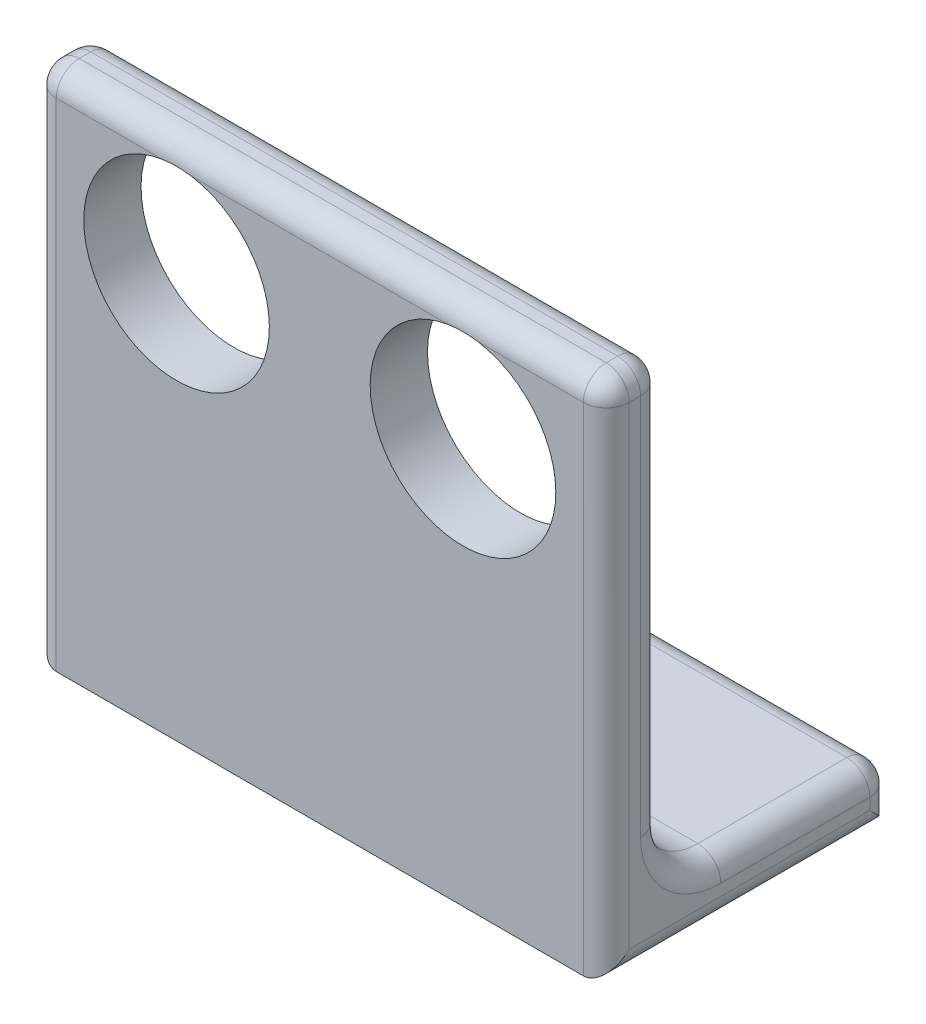
ISO-10303-21;
HEADER;
FILE_DESCRIPTION(('STEP AP214'),'2;1');
FILE_NAME('part.step','',(''),(''),'','','');
FILE_SCHEMA(('AUTOMOTIVE_DESIGN { 1 0 10303 214 1 1 1 1 }'));
ENDSEC;
DATA;
#1=APPLICATION_CONTEXT('core data for automotive mechanical design processes');
#2=APPLICATION_PROTOCOL_DEFINITION('international standard','automotive_design',2000,#1);
#3=PRODUCT_CONTEXT('',#1,'mechanical');
#4=PRODUCT('Part','Part','',(#3));
#5=PRODUCT_RELATED_PRODUCT_CATEGORY('part','',(#4));
#6=PRODUCT_DEFINITION_FORMATION('','',#4);
#7=PRODUCT_DEFINITION_CONTEXT('part definition',#1,'design');
#8=PRODUCT_DEFINITION('design','',#6,#7);
#9=PRODUCT_DEFINITION_SHAPE('','',#8);
#10=(LENGTH_UNIT() NAMED_UNIT(*) SI_UNIT(.MILLI.,.METRE.));
#11=(NAMED_UNIT(*) PLANE_ANGLE_UNIT() SI_UNIT($,.RADIAN.));
#12=(NAMED_UNIT(*) SI_UNIT($,.STERADIAN.) SOLID_ANGLE_UNIT());
#13=UNCERTAINTY_MEASURE_WITH_UNIT(LENGTH_MEASURE(1.E-05),#10,'distance_accuracy_value','');
#14=(GEOMETRIC_REPRESENTATION_CONTEXT(3) GLOBAL_UNCERTAINTY_ASSIGNED_CONTEXT((#13)) GLOBAL_UNIT_ASSIGNED_CONTEXT((#10,
#11,#12)) REPRESENTATION_CONTEXT('',''));
#15=CARTESIAN_POINT('',(0.,0.,0.));
#16=DIRECTION('',(0.,0.,1.));
#17=DIRECTION('',(1.,0.,0.));
#18=AXIS2_PLACEMENT_3D('',#15,#16,#17);
#19=CARTESIAN_POINT('',(0.,4.99999999999998,0.));
#20=DIRECTION('',(0.,0.,-1.));
#21=DIRECTION('',(-1.,0.,0.));
#22=AXIS2_PLACEMENT_3D('',#19,#20,#21);
#23=PLANE('',#22);
#24=DIRECTION('',(1.,0.,0.));
#25=VECTOR('',#24,1.);
#26=CARTESIAN_POINT('',(0.,43.3395060623667,0.));
#27=LINE('',#26,#25);
#28=CARTESIAN_POINT('',(48.,43.3395060623667,0.));
#29=VERTEX_POINT('',#28);
#30=CARTESIAN_POINT('',(38.768857754045,43.3395060623667,0.));
#31=VERTEX_POINT('',#30);
#32=EDGE_CURVE('E468',#29,#31,#27,.F.);
#33=ORIENTED_EDGE('',*,*,#32,.T.);
#34=CARTESIAN_POINT('',(37.5,35.3395060623667,0.));
#35=DIRECTION('',(0.,0.,-1.));
#36=DIRECTION('',(-1.,0.,0.));
#37=AXIS2_PLACEMENT_3D('',#34,#35,#36);
#38=CIRCLE('',#37,8.1);
#39=CARTESIAN_POINT('',(36.2311422459551,43.3395060623667,0.));
#40=VERTEX_POINT('',#39);
#41=EDGE_CURVE('E71',#31,#40,#38,.T.);
#42=ORIENTED_EDGE('',*,*,#41,.T.);
#43=CARTESIAN_POINT('',(13.768857754045,43.3395060623667,0.));
#44=VERTEX_POINT('',#43);
#45=EDGE_CURVE('E470',#40,#44,#27,.F.);
#46=ORIENTED_EDGE('',*,*,#45,.T.);
#47=CARTESIAN_POINT('',(12.5,35.3395060623667,0.));
#48=DIRECTION('',(0.,0.,-1.));
#49=DIRECTION('',(-1.,0.,0.));
#50=AXIS2_PLACEMENT_3D('',#47,#48,#49);
#51=CIRCLE('',#50,8.1);
#52=CARTESIAN_POINT('',(11.231142245955,43.3395060623667,0.));
#53=VERTEX_POINT('',#52);
#54=EDGE_CURVE('E64',#53,#44,#51,.F.);
#55=ORIENTED_EDGE('',*,*,#54,.F.);
#56=CARTESIAN_POINT('',(2.,43.3395060623667,0.));
#57=VERTEX_POINT('',#56);
#58=EDGE_CURVE('E450',#53,#57,#27,.F.);
#59=ORIENTED_EDGE('',*,*,#58,.T.);
#60=DIRECTION('',(0.,-1.,0.));
#61=VECTOR('',#60,1.);
#62=CARTESIAN_POINT('',(2.,4.99999999999998,0.));
#63=LINE('',#62,#61);
#64=CARTESIAN_POINT('',(2.,0.,0.));
#65=VERTEX_POINT('',#64);
#66=EDGE_CURVE('E384',#57,#65,#63,.T.);
#67=ORIENTED_EDGE('',*,*,#66,.T.);
#68=DIRECTION('',(1.,0.,0.));
#69=VECTOR('',#68,1.);
#70=CARTESIAN_POINT('',(0.,0.,0.));
#71=LINE('',#70,#69);
#72=CARTESIAN_POINT('',(48.,0.,0.));
#73=VERTEX_POINT('',#72);
#74=EDGE_CURVE('E328',#65,#73,#71,.T.);
#75=ORIENTED_EDGE('',*,*,#74,.T.);
#76=DIRECTION('',(0.,-1.,0.));
#77=VECTOR('',#76,1.);
#78=CARTESIAN_POINT('',(48.,4.99999999999998,0.));
#79=LINE('',#78,#77);
#80=EDGE_CURVE('E279',#73,#29,#79,.F.);
#81=ORIENTED_EDGE('',*,*,#80,.T.);
#82=EDGE_LOOP('',(#33,#42,#46,#55,#59,#67,#75,#81));
#83=FACE_BOUND('',#82,.T.);
#84=ADVANCED_FACE('F47',(#83),#23,.F.);
#85=CARTESIAN_POINT('',(0.,45.3395060623667,-5.));
#86=DIRECTION('',(0.,0.,1.));
#87=DIRECTION('',(1.,0.,0.));
#88=AXIS2_PLACEMENT_3D('',#85,#86,#87);
#89=PLANE('',#88);
#90=DIRECTION('',(-1.,0.,0.));
#91=VECTOR('',#90,1.);
#92=CARTESIAN_POINT('',(0.,43.3395060623667,-5.));
#93=LINE('',#92,#91);
#94=CARTESIAN_POINT('',(13.768857754045,43.3395060623667,-5.));
#95=VERTEX_POINT('',#94);
#96=CARTESIAN_POINT('',(36.2311422459551,43.3395060623667,-5.));
#97=VERTEX_POINT('',#96);
#98=EDGE_CURVE('E208',#95,#97,#93,.F.);
#99=ORIENTED_EDGE('',*,*,#98,.T.);
#100=CARTESIAN_POINT('',(37.5,35.3395060623667,-5.));
#101=DIRECTION('',(0.,0.,-1.));
#102=DIRECTION('',(-1.,0.,0.));
#103=AXIS2_PLACEMENT_3D('',#100,#101,#102);
#104=CIRCLE('',#103,8.1);
#105=CARTESIAN_POINT('',(38.768857754045,43.3395060623667,-5.));
#106=VERTEX_POINT('',#105);
#107=EDGE_CURVE('E211',#106,#97,#104,.T.);
#108=ORIENTED_EDGE('',*,*,#107,.F.);
#109=CARTESIAN_POINT('',(48.,43.3395060623667,-5.));
#110=VERTEX_POINT('',#109);
#111=EDGE_CURVE('E51',#106,#110,#93,.F.);
#112=ORIENTED_EDGE('',*,*,#111,.T.);
#113=DIRECTION('',(0.,-1.,0.));
#114=VECTOR('',#113,1.);
#115=CARTESIAN_POINT('',(48.,45.3395060623667,-5.));
#116=LINE('',#115,#114);
#117=CARTESIAN_POINT('',(48.,9.99999999999997,-5.));
#118=VERTEX_POINT('',#117);
#119=EDGE_CURVE('E293',#110,#118,#116,.T.);
#120=ORIENTED_EDGE('',*,*,#119,.T.);
#121=DIRECTION('',(-1.,0.,0.));
#122=VECTOR('',#121,1.);
#123=CARTESIAN_POINT('',(0.,9.99999999999997,-5.));
#124=LINE('',#123,#122);
#125=CARTESIAN_POINT('',(2.,9.99999999999997,-5.));
#126=VERTEX_POINT('',#125);
#127=EDGE_CURVE('E221',#118,#126,#124,.T.);
#128=ORIENTED_EDGE('',*,*,#127,.T.);
#129=DIRECTION('',(0.,-1.,0.));
#130=VECTOR('',#129,1.);
#131=CARTESIAN_POINT('',(2.,45.3395060623667,-5.));
#132=LINE('',#131,#130);
#133=CARTESIAN_POINT('',(2.,43.3395060623667,-5.));
#134=VERTEX_POINT('',#133);
#135=EDGE_CURVE('E371',#126,#134,#132,.F.);
#136=ORIENTED_EDGE('',*,*,#135,.T.);
#137=CARTESIAN_POINT('',(11.231142245955,43.3395060623667,-5.));
#138=VERTEX_POINT('',#137);
#139=EDGE_CURVE('E209',#134,#138,#93,.F.);
#140=ORIENTED_EDGE('',*,*,#139,.T.);
#141=CARTESIAN_POINT('',(12.5,35.3395060623667,-5.));
#142=DIRECTION('',(0.,0.,1.));
#143=DIRECTION('',(1.,0.,0.));
#144=AXIS2_PLACEMENT_3D('',#141,#142,#143);
#145=CIRCLE('',#144,8.1);
#146=EDGE_CURVE('E194',#138,#95,#145,.T.);
#147=ORIENTED_EDGE('',*,*,#146,.T.);
#148=EDGE_LOOP('',(#99,#108,#112,#120,#128,#136,#140,#147));
#149=FACE_BOUND('',#148,.T.);
#150=ADVANCED_FACE('F206',(#149),#89,.F.);
#151=CARTESIAN_POINT('',(0.,43.3395060623667,-2.));
#152=DIRECTION('',(1.,0.,0.));
#153=DIRECTION('',(0.,0.,-1.));
#154=AXIS2_PLACEMENT_3D('',#151,#152,#153);
#155=CYLINDRICAL_SURFACE('',#154,2.);
#156=CARTESIAN_POINT('',(38.768857754045,43.3395060623667,0.));
#157=CARTESIAN_POINT('',(38.6636691925274,43.356190905106,-1.37779770013299E-05));
#158=CARTESIAN_POINT('',(38.5581516499131,43.3707988000134,-0.000209294897362309));
#159=CARTESIAN_POINT('',(38.3466231250194,43.3958431394812,-0.000750693316836424));
#160=CARTESIAN_POINT('',(38.2406121433183,43.4062795889296,-0.00109657463975416));
#161=CARTESIAN_POINT('',(38.0289139331765,43.4229122237599,-0.00172365555034055));
#162=CARTESIAN_POINT('',(37.9232287226811,43.4291340896309,-0.00200523981328003));
#163=CARTESIAN_POINT('',(37.7116956743523,43.4374310005774,-0.00239419391511557));
#164=CARTESIAN_POINT('',(37.6058478371762,43.4395060623667,-0.00250156445618202));
#165=CARTESIAN_POINT('',(37.3941521628238,43.4395060623667,-0.00250156445618193));
#166=CARTESIAN_POINT('',(37.2883043256477,43.4374310005774,-0.00239419391511539));
#167=CARTESIAN_POINT('',(37.0767712773189,43.4291340896309,-0.00200523981327971));
#168=CARTESIAN_POINT('',(36.9710860668235,43.4229122237599,-0.00172365555034018));
#169=CARTESIAN_POINT('',(36.7593878566817,43.4062795889296,-0.00109657463975375));
#170=CARTESIAN_POINT('',(36.6533768749806,43.3958431394812,-0.000750693316836028));
#171=CARTESIAN_POINT('',(36.4418483500869,43.3707988000134,-0.000209294897362058));
#172=CARTESIAN_POINT('',(36.3363308074726,43.356190905106,-1.37779770012064E-05));
#173=CARTESIAN_POINT('',(36.2311422459551,43.3395060623667,0.));
#174=B_SPLINE_CURVE_WITH_KNOTS('',3,(#156,#157,#158,#159,#160,#161,#162,#163,#164,#165,#166,
#167,#168,#169,#170,#171,#172,#173),.UNSPECIFIED.,.F.,.F.,(4,2,2,2,2,2,2,2,4),(0.,
0.31948945098359,0.638978527593862,0.95650293304343,1.2740260587041,1.59154918436477,
1.90907358981434,2.22856266642461,2.5480521174082),.UNSPECIFIED.);
#175=EDGE_CURVE('E613',#31,#40,#174,.T.);
#176=ORIENTED_EDGE('',*,*,#175,.F.);
#177=ORIENTED_EDGE('',*,*,#32,.F.);
#178=CARTESIAN_POINT('',(48.,43.3395060623667,-2.));
#179=DIRECTION('',(1.,0.,0.));
#180=DIRECTION('',(0.,0.,-1.));
#181=AXIS2_PLACEMENT_3D('',#178,#179,#180);
#182=CIRCLE('',#181,2.);
#183=CARTESIAN_POINT('',(48.,45.3395060623667,-2.));
#184=VERTEX_POINT('',#183);
#185=EDGE_CURVE('E282',#29,#184,#182,.F.);
#186=ORIENTED_EDGE('',*,*,#185,.T.);
#187=DIRECTION('',(1.,0.,0.));
#188=VECTOR('',#187,1.);
#189=CARTESIAN_POINT('',(0.,45.3395060623667,-2.));
#190=LINE('',#189,#188);
#191=CARTESIAN_POINT('',(2.,45.3395060623667,-2.));
#192=VERTEX_POINT('',#191);
#193=EDGE_CURVE('E461',#192,#184,#190,.T.);
#194=ORIENTED_EDGE('',*,*,#193,.F.);
#195=CARTESIAN_POINT('',(2.,43.3395060623667,-2.));
#196=DIRECTION('',(1.,0.,0.));
#197=DIRECTION('',(0.,0.,-1.));
#198=AXIS2_PLACEMENT_3D('',#195,#196,#197);
#199=CIRCLE('',#198,2.);
#200=EDGE_CURVE('E380',#192,#57,#199,.T.);
#201=ORIENTED_EDGE('',*,*,#200,.T.);
#202=ORIENTED_EDGE('',*,*,#58,.F.);
#203=CARTESIAN_POINT('',(11.231142245955,43.3395060623667,0.));
#204=CARTESIAN_POINT('',(11.3363308074726,43.356190905106,-1.3777977001209E-05));
#205=CARTESIAN_POINT('',(11.4418483500869,43.3707988000134,-0.000209294897362112));
#206=CARTESIAN_POINT('',(11.6533768749806,43.3958431394812,-0.000750693316836176));
#207=CARTESIAN_POINT('',(11.7593878566817,43.4062795889296,-0.00109657463975394));
#208=CARTESIAN_POINT('',(11.9710860668235,43.4229122237599,-0.00172365555034049));
#209=CARTESIAN_POINT('',(12.0767712773189,43.4291340896309,-0.00200523981328009));
#210=CARTESIAN_POINT('',(12.2883043256477,43.4374310005774,-0.00239419391511583));
#211=CARTESIAN_POINT('',(12.3941521628238,43.4395060623667,-0.00250156445618234));
#212=CARTESIAN_POINT('',(12.6058478371762,43.4395060623667,-0.00250156445618216));
#213=CARTESIAN_POINT('',(12.7116956743523,43.4374310005774,-0.00239419391511547));
#214=CARTESIAN_POINT('',(12.9232287226811,43.4291340896309,-0.00200523981327976));
#215=CARTESIAN_POINT('',(13.0289139331765,43.4229122237599,-0.00172365555034036));
#216=CARTESIAN_POINT('',(13.2406121433183,43.4062795889296,-0.00109657463975398));
#217=CARTESIAN_POINT('',(13.3466231250194,43.3958431394812,-0.000750693316836164));
#218=CARTESIAN_POINT('',(13.5581516499132,43.3707988000134,-0.000209294897362004));
#219=CARTESIAN_POINT('',(13.6636691925274,43.356190905106,-1.37779770010524E-05));
#220=CARTESIAN_POINT('',(13.768857754045,43.3395060623667,0.));
#221=B_SPLINE_CURVE_WITH_KNOTS('',3,(#203,#204,#205,#206,#207,#208,#209,#210,#211,#212,#213,
#214,#215,#216,#217,#218,#219,#220),.UNSPECIFIED.,.F.,.F.,(4,2,2,2,2,2,2,2,4),(0.,
0.31948945098359,0.638978527593864,0.956502933043436,1.27402605870411,1.59154918436479,
1.90907358981436,2.22856266642463,2.54805211740822),.UNSPECIFIED.);
#222=EDGE_CURVE('E478',#53,#44,#221,.T.);
#223=ORIENTED_EDGE('',*,*,#222,.T.);
#224=ORIENTED_EDGE('',*,*,#45,.F.);
#225=EDGE_LOOP('',(#176,#177,#186,#194,#201,#202,#223,#224));
#226=FACE_BOUND('',#225,.T.);
#227=ADVANCED_FACE('F542',(#226),#155,.T.);
#228=CARTESIAN_POINT('',(0.,43.3395060623667,-3.));
#229=DIRECTION('',(-1.,0.,0.));
#230=DIRECTION('',(0.,0.,1.));
#231=AXIS2_PLACEMENT_3D('',#228,#229,#230);
#232=CYLINDRICAL_SURFACE('',#231,2.);
#233=CARTESIAN_POINT('',(36.2311422459551,43.3395060623667,-5.));
#234=CARTESIAN_POINT('',(36.301051974028,43.3505944829167,-5.00000073215949));
#235=CARTESIAN_POINT('',(36.3711071123414,43.3607660737245,-4.99997720343605));
#236=CARTESIAN_POINT('',(36.5114599223316,43.3792696061048,-4.99988382074083));
#237=CARTESIAN_POINT('',(36.5817575941123,43.3876015468896,-4.99981396674922));
#238=CARTESIAN_POINT('',(36.7225471842585,43.402419786312,-4.99963012995958));
#239=CARTESIAN_POINT('',(36.7930391027904,43.4089060833686,-4.99951614712375));
#240=CARTESIAN_POINT('',(36.9341687819068,43.4200286489572,-4.99923307046629));
#241=CARTESIAN_POINT('',(37.0048065426786,43.4246649151118,-4.99906397657383));
#242=CARTESIAN_POINT('',(37.1461791717799,43.4320842189485,-4.99871241027506));
#243=CARTESIAN_POINT('',(37.2169140402755,43.4348672534555,-4.99852993784583));
#244=CARTESIAN_POINT('',(37.3584329870354,43.4385781695686,-4.99799566650403));
#245=CARTESIAN_POINT('',(37.4292170654048,43.4395060472019,-4.99764386722881));
#246=CARTESIAN_POINT('',(37.5403207374343,43.4395060710052,-4.99741559194855));
#247=CARTESIAN_POINT('',(37.5806411037266,43.4392049986001,-4.99739971233937));
#248=CARTESIAN_POINT('',(37.6915127518982,43.4375491528754,-4.99746017439243));
#249=CARTESIAN_POINT('',(37.7620554769072,43.4355734264973,-4.99761462018613));
#250=CARTESIAN_POINT('',(37.9332833381333,43.4285373440372,-4.99802884606857));
#251=CARTESIAN_POINT('',(38.0339302044027,43.4225179097886,-4.99830540217157));
#252=CARTESIAN_POINT('',(38.2288211815174,43.407206162542,-4.99885516288592));
#253=CARTESIAN_POINT('',(38.3230827539477,43.3981349348096,-4.99912755012956));
#254=CARTESIAN_POINT('',(38.4877019898519,43.3793746116971,-4.99955679238724));
#255=CARTESIAN_POINT('',(38.558142481171,43.3704073345152,-4.99972550465264));
#256=CARTESIAN_POINT('',(38.6753145625032,43.3539227966963,-4.99992166276904));
#257=CARTESIAN_POINT('',(38.7221187590093,43.3469192699824,-4.99997745611781));
#258=CARTESIAN_POINT('',(38.768857754045,43.3395060623667,-5.));
#259=B_SPLINE_CURVE_WITH_KNOTS('',3,(#233,#234,#235,#236,#237,#238,#239,#240,#241,#242,#243,
#244,#245,#246,#247,#248,#249,#250,#251,#252,#253,#254,#255,#256,#257,#258),.UNSPECIFIED.,.F.,
.F.,(4,2,2,2,2,2,2,2,2,2,2,2,4),(0.,0.212344816039998,0.424689723019202,0.637034811894594,
0.849380173622934,1.06172589916063,1.27407207946361,1.39503279732797,1.60672020133679,
1.90912811956147,2.19316152572127,2.40616456203434,2.54813326245267),.UNSPECIFIED.);
#260=EDGE_CURVE('E12',#97,#106,#259,.T.);
#261=ORIENTED_EDGE('',*,*,#260,.F.);
#262=ORIENTED_EDGE('',*,*,#98,.F.);
#263=CARTESIAN_POINT('',(13.768857754045,43.3395060623667,-5.));
#264=CARTESIAN_POINT('',(13.6634192670985,43.3562351652984,-4.99998710537362));
#265=CARTESIAN_POINT('',(13.5576546948731,43.3709198636578,-4.99978956812737));
#266=CARTESIAN_POINT('',(13.3461236322783,43.3960735574062,-4.99924271062318));
#267=CARTESIAN_POINT('',(13.2403594260535,43.4065617899314,-4.99889409860628));
#268=CARTESIAN_POINT('',(13.0288286944693,43.4233258358828,-4.99825946433671));
#269=CARTESIAN_POINT('',(12.9230632050412,43.4296146846032,-4.99797325027555));
#270=CARTESIAN_POINT('',(12.7115316364473,43.4379927895035,-4.99757824999116));
#271=CARTESIAN_POINT('',(12.6057658182236,43.4400886149299,-4.99746918627544));
#272=CARTESIAN_POINT('',(12.3942341817764,43.4400886149299,-4.99746918627544));
#273=CARTESIAN_POINT('',(12.2884683635527,43.4379927895035,-4.99757824999116));
#274=CARTESIAN_POINT('',(12.0769367949588,43.4296146846032,-4.99797325027555));
#275=CARTESIAN_POINT('',(11.9711713055307,43.4233258358828,-4.99825946433671));
#276=CARTESIAN_POINT('',(11.7596405739465,43.4065617899314,-4.99889409860628));
#277=CARTESIAN_POINT('',(11.6538763677218,43.3960735574062,-4.99924271062318));
#278=CARTESIAN_POINT('',(11.4423453051269,43.3709198636578,-4.99978956812737));
#279=CARTESIAN_POINT('',(11.3365807329015,43.3562351652984,-4.99998710537362));
#280=CARTESIAN_POINT('',(11.231142245955,43.3395060623667,-5.));
#281=B_SPLINE_CURVE_WITH_KNOTS('',3,(#263,#264,#265,#266,#267,#268,#269,#270,#271,#272,#273,
#274,#275,#276,#277,#278,#279,#280),.UNSPECIFIED.,.F.,.F.,(4,2,2,2,2,2,2,2,4),(0.,
0.320254562494804,0.639023738088675,0.956798765622731,1.27407554112724,1.59135231663175,
1.9091273441658,2.22789651975967,2.54815108225448),.UNSPECIFIED.);
#282=EDGE_CURVE('E58',#95,#138,#281,.T.);
#283=ORIENTED_EDGE('',*,*,#282,.T.);
#284=ORIENTED_EDGE('',*,*,#139,.F.);
#285=CARTESIAN_POINT('',(2.,43.3395060623667,-3.));
#286=DIRECTION('',(-1.,0.,0.));
#287=DIRECTION('',(0.,0.,1.));
#288=AXIS2_PLACEMENT_3D('',#285,#286,#287);
#289=CIRCLE('',#288,2.);
#290=CARTESIAN_POINT('',(2.,45.3395060623667,-3.));
#291=VERTEX_POINT('',#290);
#292=EDGE_CURVE('E374',#134,#291,#289,.F.);
#293=ORIENTED_EDGE('',*,*,#292,.T.);
#294=DIRECTION('',(-1.,0.,0.));
#295=VECTOR('',#294,1.);
#296=CARTESIAN_POINT('',(0.,45.3395060623667,-3.));
#297=LINE('',#296,#295);
#298=CARTESIAN_POINT('',(48.,45.3395060623667,-3.));
#299=VERTEX_POINT('',#298);
#300=EDGE_CURVE('E224',#299,#291,#297,.T.);
#301=ORIENTED_EDGE('',*,*,#300,.F.);
#302=CARTESIAN_POINT('',(48.,43.3395060623667,-3.));
#303=DIRECTION('',(-1.,0.,0.));
#304=DIRECTION('',(0.,0.,1.));
#305=AXIS2_PLACEMENT_3D('',#302,#303,#304);
#306=CIRCLE('',#305,2.);
#307=EDGE_CURVE('E289',#299,#110,#306,.T.);
#308=ORIENTED_EDGE('',*,*,#307,.T.);
#309=ORIENTED_EDGE('',*,*,#111,.F.);
#310=EDGE_LOOP('',(#261,#262,#283,#284,#293,#301,#308,#309));
#311=FACE_BOUND('',#310,.T.);
#312=ADVANCED_FACE('F214',(#311),#232,.T.);
#313=CARTESIAN_POINT('',(0.,4.99999999999998,0.));
#314=DIRECTION('',(0.,-1.,0.));
#315=DIRECTION('',(0.,0.,-1.));
#316=AXIS2_PLACEMENT_3D('',#313,#314,#315);
#317=PLANE('',#316);
#318=DIRECTION('',(-1.,0.,0.));
#319=VECTOR('',#318,1.);
#320=CARTESIAN_POINT('',(0.,4.99999999999998,-23.));
#321=LINE('',#320,#319);
#322=CARTESIAN_POINT('',(48.,4.99999999999998,-23.));
#323=VERTEX_POINT('',#322);
#324=CARTESIAN_POINT('',(2.,4.99999999999998,-23.));
#325=VERTEX_POINT('',#324);
#326=EDGE_CURVE('E335',#323,#325,#321,.T.);
#327=ORIENTED_EDGE('',*,*,#326,.T.);
#328=DIRECTION('',(0.,0.,1.));
#329=VECTOR('',#328,1.);
#330=CARTESIAN_POINT('',(2.,4.99999999999998,0.));
#331=LINE('',#330,#329);
#332=CARTESIAN_POINT('',(2.,4.99999999999998,-10.));
#333=VERTEX_POINT('',#332);
#334=EDGE_CURVE('E201',#325,#333,#331,.T.);
#335=ORIENTED_EDGE('',*,*,#334,.T.);
#336=DIRECTION('',(-1.,0.,0.));
#337=VECTOR('',#336,1.);
#338=CARTESIAN_POINT('',(50.,4.99999999999998,-10.));
#339=LINE('',#338,#337);
#340=CARTESIAN_POINT('',(48.,4.99999999999998,-10.));
#341=VERTEX_POINT('',#340);
#342=EDGE_CURVE('E238',#333,#341,#339,.F.);
#343=ORIENTED_EDGE('',*,*,#342,.T.);
#344=DIRECTION('',(0.,0.,-1.));
#345=VECTOR('',#344,1.);
#346=CARTESIAN_POINT('',(48.,4.99999999999998,0.));
#347=LINE('',#346,#345);
#348=EDGE_CURVE('E268',#341,#323,#347,.T.);
#349=ORIENTED_EDGE('',*,*,#348,.T.);
#350=EDGE_LOOP('',(#327,#335,#343,#349));
#351=FACE_BOUND('',#350,.T.);
#352=ADVANCED_FACE('F511',(#351),#317,.F.);
#353=CARTESIAN_POINT('',(0.,4.99999999999998,0.));
#354=DIRECTION('',(1.,0.,0.));
#355=DIRECTION('',(0.,0.,-1.));
#356=AXIS2_PLACEMENT_3D('',#353,#354,#355);
#357=PLANE('',#356);
#358=DIRECTION('',(0.,-1.,0.));
#359=VECTOR('',#358,1.);
#360=CARTESIAN_POINT('',(0.,4.99999999999998,-3.));
#361=LINE('',#360,#359);
#362=CARTESIAN_POINT('',(0.,43.3395060623667,-3.));
#363=VERTEX_POINT('',#362);
#364=CARTESIAN_POINT('',(0.,9.99999999999997,-3.));
#365=VERTEX_POINT('',#364);
#366=EDGE_CURVE('E360',#363,#365,#361,.T.);
#367=ORIENTED_EDGE('',*,*,#366,.T.);
#368=CARTESIAN_POINT('',(0.,9.99999999999997,-10.));
#369=DIRECTION('',(1.,0.,0.));
#370=DIRECTION('',(0.,0.,-1.));
#371=AXIS2_PLACEMENT_3D('',#368,#369,#370);
#372=CIRCLE('',#371,7.);
#373=CARTESIAN_POINT('',(0.,2.99999999999998,-10.));
#374=VERTEX_POINT('',#373);
#375=EDGE_CURVE('E363',#365,#374,#372,.T.);
#376=ORIENTED_EDGE('',*,*,#375,.T.);
#377=DIRECTION('',(0.,0.,1.));
#378=VECTOR('',#377,1.);
#379=CARTESIAN_POINT('',(0.,2.99999999999998,0.));
#380=LINE('',#379,#378);
#381=CARTESIAN_POINT('',(0.,2.99999999999998,-23.));
#382=VERTEX_POINT('',#381);
#383=EDGE_CURVE('E342',#374,#382,#380,.F.);
#384=ORIENTED_EDGE('',*,*,#383,.T.);
#385=DIRECTION('',(0.,-1.,0.));
#386=VECTOR('',#385,1.);
#387=CARTESIAN_POINT('',(0.,4.99999999999998,-23.));
#388=LINE('',#387,#386);
#389=CARTESIAN_POINT('',(0.,2.,-23.));
#390=VERTEX_POINT('',#389);
#391=EDGE_CURVE('E348',#382,#390,#388,.T.);
#392=ORIENTED_EDGE('',*,*,#391,.T.);
#393=DIRECTION('',(0.,0.,1.));
#394=VECTOR('',#393,1.);
#395=CARTESIAN_POINT('',(0.,2.,0.));
#396=LINE('',#395,#394);
#397=CARTESIAN_POINT('',(0.,2.,-2.));
#398=VERTEX_POINT('',#397);
#399=EDGE_CURVE('E351',#390,#398,#396,.T.);
#400=ORIENTED_EDGE('',*,*,#399,.T.);
#401=DIRECTION('',(0.,-1.,0.));
#402=VECTOR('',#401,1.);
#403=CARTESIAN_POINT('',(0.,4.99999999999998,-2.));
#404=LINE('',#403,#402);
#405=CARTESIAN_POINT('',(0.,43.3395060623667,-2.));
#406=VERTEX_POINT('',#405);
#407=EDGE_CURVE('E354',#398,#406,#404,.F.);
#408=ORIENTED_EDGE('',*,*,#407,.T.);
#409=DIRECTION('',(0.,0.,1.));
#410=VECTOR('',#409,1.);
#411=CARTESIAN_POINT('',(0.,43.3395060623667,0.));
#412=LINE('',#411,#410);
#413=EDGE_CURVE('E357',#406,#363,#412,.F.);
#414=ORIENTED_EDGE('',*,*,#413,.T.);
#415=EDGE_LOOP('',(#367,#376,#384,#392,#400,#408,#414));
#416=FACE_BOUND('',#415,.T.);
#417=ADVANCED_FACE('F526',(#416),#357,.F.);
#418=CARTESIAN_POINT('',(50.,4.99999999999998,0.));
#419=DIRECTION('',(-1.,0.,0.));
#420=DIRECTION('',(0.,0.,1.));
#421=AXIS2_PLACEMENT_3D('',#418,#419,#420);
#422=PLANE('',#421);
#423=DIRECTION('',(0.,0.,-1.));
#424=VECTOR('',#423,1.);
#425=CARTESIAN_POINT('',(50.,2.99999999999998,0.));
#426=LINE('',#425,#424);
#427=CARTESIAN_POINT('',(50.,2.99999999999998,-23.));
#428=VERTEX_POINT('',#427);
#429=CARTESIAN_POINT('',(50.,2.99999999999998,-10.));
#430=VERTEX_POINT('',#429);
#431=EDGE_CURVE('E257',#428,#430,#426,.F.);
#432=ORIENTED_EDGE('',*,*,#431,.T.);
#433=CARTESIAN_POINT('',(50.,9.99999999999997,-10.));
#434=DIRECTION('',(-1.,0.,0.));
#435=DIRECTION('',(0.,0.,1.));
#436=AXIS2_PLACEMENT_3D('',#433,#434,#435);
#437=CIRCLE('',#436,7.);
#438=CARTESIAN_POINT('',(50.,9.99999999999997,-3.));
#439=VERTEX_POINT('',#438);
#440=EDGE_CURVE('E260',#430,#439,#437,.T.);
#441=ORIENTED_EDGE('',*,*,#440,.T.);
#442=DIRECTION('',(0.,-1.,0.));
#443=VECTOR('',#442,1.);
#444=CARTESIAN_POINT('',(50.,4.99999999999998,-3.));
#445=LINE('',#444,#443);
#446=CARTESIAN_POINT('',(50.,43.3395060623667,-3.));
#447=VERTEX_POINT('',#446);
#448=EDGE_CURVE('E241',#439,#447,#445,.F.);
#449=ORIENTED_EDGE('',*,*,#448,.T.);
#450=DIRECTION('',(0.,0.,-1.));
#451=VECTOR('',#450,1.);
#452=CARTESIAN_POINT('',(50.,43.3395060623667,0.));
#453=LINE('',#452,#451);
#454=CARTESIAN_POINT('',(50.,43.3395060623667,-2.));
#455=VERTEX_POINT('',#454);
#456=EDGE_CURVE('E244',#447,#455,#453,.F.);
#457=ORIENTED_EDGE('',*,*,#456,.T.);
#458=DIRECTION('',(0.,-1.,0.));
#459=VECTOR('',#458,1.);
#460=CARTESIAN_POINT('',(50.,4.99999999999998,-2.));
#461=LINE('',#460,#459);
#462=CARTESIAN_POINT('',(50.,2.,-2.));
#463=VERTEX_POINT('',#462);
#464=EDGE_CURVE('E247',#455,#463,#461,.T.);
#465=ORIENTED_EDGE('',*,*,#464,.T.);
#466=DIRECTION('',(0.,0.,-1.));
#467=VECTOR('',#466,1.);
#468=CARTESIAN_POINT('',(50.,2.,-25.));
#469=LINE('',#468,#467);
#470=CARTESIAN_POINT('',(50.,2.,-23.));
#471=VERTEX_POINT('',#470);
#472=EDGE_CURVE('E250',#463,#471,#469,.T.);
#473=ORIENTED_EDGE('',*,*,#472,.T.);
#474=DIRECTION('',(0.,-1.,0.));
#475=VECTOR('',#474,1.);
#476=CARTESIAN_POINT('',(50.,4.99999999999998,-23.));
#477=LINE('',#476,#475);
#478=EDGE_CURVE('E253',#471,#428,#477,.F.);
#479=ORIENTED_EDGE('',*,*,#478,.T.);
#480=EDGE_LOOP('',(#432,#441,#449,#457,#465,#473,#479));
#481=FACE_BOUND('',#480,.T.);
#482=ADVANCED_FACE('F554',(#481),#422,.F.);
#483=CARTESIAN_POINT('',(0.,4.99999999999998,-25.));
#484=DIRECTION('',(0.,0.,1.));
#485=DIRECTION('',(1.,0.,0.));
#486=AXIS2_PLACEMENT_3D('',#483,#484,#485);
#487=PLANE('',#486);
#488=DIRECTION('',(-1.,0.,0.));
#489=VECTOR('',#488,1.);
#490=CARTESIAN_POINT('',(0.,0.,-25.));
#491=LINE('',#490,#489);
#492=CARTESIAN_POINT('',(48.,0.,-25.));
#493=VERTEX_POINT('',#492);
#494=CARTESIAN_POINT('',(2.,0.,-25.));
#495=VERTEX_POINT('',#494);
#496=EDGE_CURVE('E458',#493,#495,#491,.T.);
#497=ORIENTED_EDGE('',*,*,#496,.T.);
#498=DIRECTION('',(0.,-1.,0.));
#499=VECTOR('',#498,1.);
#500=CARTESIAN_POINT('',(2.,4.99999999999998,-25.));
#501=LINE('',#500,#499);
#502=CARTESIAN_POINT('',(2.,2.99999999999998,-25.));
#503=VERTEX_POINT('',#502);
#504=EDGE_CURVE('E390',#495,#503,#501,.F.);
#505=ORIENTED_EDGE('',*,*,#504,.T.);
#506=DIRECTION('',(-1.,0.,0.));
#507=VECTOR('',#506,1.);
#508=CARTESIAN_POINT('',(0.,2.99999999999998,-25.));
#509=LINE('',#508,#507);
#510=CARTESIAN_POINT('',(48.,2.99999999999998,-25.));
#511=VERTEX_POINT('',#510);
#512=EDGE_CURVE('E339',#503,#511,#509,.F.);
#513=ORIENTED_EDGE('',*,*,#512,.T.);
#514=DIRECTION('',(0.,-1.,0.));
#515=VECTOR('',#514,1.);
#516=CARTESIAN_POINT('',(48.,4.99999999999998,-25.));
#517=LINE('',#516,#515);
#518=EDGE_CURVE('E272',#511,#493,#517,.T.);
#519=ORIENTED_EDGE('',*,*,#518,.T.);
#520=EDGE_LOOP('',(#497,#505,#513,#519));
#521=FACE_BOUND('',#520,.T.);
#522=ADVANCED_FACE('F648',(#521),#487,.F.);
#523=CARTESIAN_POINT('',(0.,0.,0.));
#524=DIRECTION('',(0.,-1.,0.));
#525=DIRECTION('',(0.,0.,-1.));
#526=AXIS2_PLACEMENT_3D('',#523,#524,#525);
#527=PLANE('',#526);
#528=ORIENTED_EDGE('',*,*,#74,.F.);
#529=DIRECTION('',(0.,0.,1.));
#530=VECTOR('',#529,1.);
#531=CARTESIAN_POINT('',(2.,0.,-25.));
#532=LINE('',#531,#530);
#533=EDGE_CURVE('E387',#65,#495,#532,.F.);
#534=ORIENTED_EDGE('',*,*,#533,.T.);
#535=ORIENTED_EDGE('',*,*,#496,.F.);
#536=DIRECTION('',(0.,0.,-1.));
#537=VECTOR('',#536,1.);
#538=CARTESIAN_POINT('',(48.,0.,0.));
#539=LINE('',#538,#537);
#540=EDGE_CURVE('E275',#493,#73,#539,.F.);
#541=ORIENTED_EDGE('',*,*,#540,.T.);
#542=EDGE_LOOP('',(#528,#534,#535,#541));
#543=FACE_BOUND('',#542,.T.);
#544=ADVANCED_FACE('F452',(#543),#527,.T.);
#545=CARTESIAN_POINT('',(0.,45.3395060623667,0.));
#546=DIRECTION('',(0.,-1.,0.));
#547=DIRECTION('',(0.,0.,-1.));
#548=AXIS2_PLACEMENT_3D('',#545,#546,#547);
#549=PLANE('',#548);
#550=ORIENTED_EDGE('',*,*,#300,.T.);
#551=DIRECTION('',(0.,0.,1.));
#552=VECTOR('',#551,1.);
#553=CARTESIAN_POINT('',(2.,45.3395060623667,0.));
#554=LINE('',#553,#552);
#555=EDGE_CURVE('E377',#291,#192,#554,.T.);
#556=ORIENTED_EDGE('',*,*,#555,.T.);
#557=ORIENTED_EDGE('',*,*,#193,.T.);
#558=DIRECTION('',(0.,0.,-1.));
#559=VECTOR('',#558,1.);
#560=CARTESIAN_POINT('',(48.,45.3395060623667,0.));
#561=LINE('',#560,#559);
#562=EDGE_CURVE('E286',#184,#299,#561,.T.);
#563=ORIENTED_EDGE('',*,*,#562,.T.);
#564=EDGE_LOOP('',(#550,#556,#557,#563));
#565=FACE_BOUND('',#564,.T.);
#566=ADVANCED_FACE('F540',(#565),#549,.F.);
#567=CARTESIAN_POINT('',(0.,9.99999999999997,-10.));
#568=DIRECTION('',(1.,0.,0.));
#569=DIRECTION('',(0.,0.,-1.));
#570=AXIS2_PLACEMENT_3D('',#567,#568,#569);
#571=CYLINDRICAL_SURFACE('',#570,5.);
#572=ORIENTED_EDGE('',*,*,#342,.F.);
#573=CARTESIAN_POINT('',(2.,9.99999999999997,-10.));
#574=DIRECTION('',(1.,0.,0.));
#575=DIRECTION('',(0.,0.,-1.));
#576=AXIS2_PLACEMENT_3D('',#573,#574,#575);
#577=CIRCLE('',#576,5.);
#578=EDGE_CURVE('E367',#333,#126,#577,.F.);
#579=ORIENTED_EDGE('',*,*,#578,.T.);
#580=ORIENTED_EDGE('',*,*,#127,.F.);
#581=CARTESIAN_POINT('',(48.,9.99999999999997,-10.));
#582=DIRECTION('',(-1.,0.,0.));
#583=DIRECTION('',(0.,0.,1.));
#584=AXIS2_PLACEMENT_3D('',#581,#582,#583);
#585=CIRCLE('',#584,5.);
#586=EDGE_CURVE('E264',#118,#341,#585,.F.);
#587=ORIENTED_EDGE('',*,*,#586,.T.);
#588=EDGE_LOOP('',(#572,#579,#580,#587));
#589=FACE_BOUND('',#588,.T.);
#590=ADVANCED_FACE('F499',(#589),#571,.F.);
#591=CARTESIAN_POINT('',(48.,4.99999999999998,-2.));
#592=DIRECTION('',(0.,-1.,0.));
#593=DIRECTION('',(0.,0.,-1.));
#594=AXIS2_PLACEMENT_3D('',#591,#592,#593);
#595=CYLINDRICAL_SURFACE('',#594,2.);
#596=CARTESIAN_POINT('',(48.,43.3395060623667,-2.));
#597=DIRECTION('',(0.,1.,0.));
#598=DIRECTION('',(0.,0.,1.));
#599=AXIS2_PLACEMENT_3D('',#596,#597,#598);
#600=CIRCLE('',#599,2.);
#601=EDGE_CURVE('E324',#29,#455,#600,.T.);
#602=ORIENTED_EDGE('',*,*,#601,.F.);
#603=ORIENTED_EDGE('',*,*,#80,.F.);
#604=CARTESIAN_POINT('',(48.,2.,-2.));
#605=DIRECTION('',(0.,-0.707106781186547,-0.707106781186547));
#606=DIRECTION('',(0.,-0.707106781186547,0.707106781186547));
#607=AXIS2_PLACEMENT_3D('',#604,#605,#606);
#608=ELLIPSE('',#607,2.82842712474619,2.);
#609=EDGE_CURVE('E320',#463,#73,#608,.T.);
#610=ORIENTED_EDGE('',*,*,#609,.F.);
#611=ORIENTED_EDGE('',*,*,#464,.F.);
#612=EDGE_LOOP('',(#602,#603,#610,#611));
#613=FACE_BOUND('',#612,.T.);
#614=ADVANCED_FACE('F557',(#613),#595,.T.);
#615=CARTESIAN_POINT('',(48.,43.3395060623667,-2.));
#616=DIRECTION('',(-1.,0.,0.));
#617=DIRECTION('',(0.,0.,1.));
#618=AXIS2_PLACEMENT_3D('',#615,#616,#617);
#619=SPHERICAL_SURFACE('',#618,2.);
#620=ORIENTED_EDGE('',*,*,#185,.F.);
#621=ORIENTED_EDGE('',*,*,#601,.T.);
#622=CARTESIAN_POINT('',(48.,43.3395060623667,-2.));
#623=DIRECTION('',(0.,0.,-1.));
#624=DIRECTION('',(-1.,0.,0.));
#625=AXIS2_PLACEMENT_3D('',#622,#623,#624);
#626=CIRCLE('',#625,2.);
#627=EDGE_CURVE('E317',#184,#455,#626,.T.);
#628=ORIENTED_EDGE('',*,*,#627,.F.);
#629=EDGE_LOOP('',(#620,#621,#628));
#630=FACE_BOUND('',#629,.T.);
#631=ADVANCED_FACE('F548',(#630),#619,.T.);
#632=CARTESIAN_POINT('',(48.,2.,0.));
#633=DIRECTION('',(0.,0.,1.));
#634=DIRECTION('',(1.,0.,0.));
#635=AXIS2_PLACEMENT_3D('',#632,#633,#634);
#636=CYLINDRICAL_SURFACE('',#635,2.);
#637=ORIENTED_EDGE('',*,*,#609,.T.);
#638=ORIENTED_EDGE('',*,*,#540,.F.);
#639=CARTESIAN_POINT('',(48.,2.,-23.));
#640=DIRECTION('',(0.,-0.707106781186547,0.707106781186547));
#641=DIRECTION('',(0.,0.707106781186547,0.707106781186547));
#642=AXIS2_PLACEMENT_3D('',#639,#640,#641);
#643=ELLIPSE('',#642,2.82842712474619,2.);
#644=EDGE_CURVE('E313',#471,#493,#643,.F.);
#645=ORIENTED_EDGE('',*,*,#644,.F.);
#646=ORIENTED_EDGE('',*,*,#472,.F.);
#647=EDGE_LOOP('',(#637,#638,#645,#646));
#648=FACE_BOUND('',#647,.T.);
#649=ADVANCED_FACE('F561',(#648),#636,.T.);
#650=CARTESIAN_POINT('',(48.,43.3395060623667,0.));
#651=DIRECTION('',(0.,0.,-1.));
#652=DIRECTION('',(-1.,0.,0.));
#653=AXIS2_PLACEMENT_3D('',#650,#651,#652);
#654=CYLINDRICAL_SURFACE('',#653,2.);
#655=ORIENTED_EDGE('',*,*,#627,.T.);
#656=ORIENTED_EDGE('',*,*,#456,.F.);
#657=CARTESIAN_POINT('',(48.,43.3395060623667,-3.));
#658=DIRECTION('',(0.,0.,-1.));
#659=DIRECTION('',(-1.,0.,0.));
#660=AXIS2_PLACEMENT_3D('',#657,#658,#659);
#661=CIRCLE('',#660,2.);
#662=EDGE_CURVE('E309',#299,#447,#661,.T.);
#663=ORIENTED_EDGE('',*,*,#662,.F.);
#664=ORIENTED_EDGE('',*,*,#562,.F.);
#665=EDGE_LOOP('',(#655,#656,#663,#664));
#666=FACE_BOUND('',#665,.T.);
#667=ADVANCED_FACE('F551',(#666),#654,.T.);
#668=CARTESIAN_POINT('',(48.,4.99999999999998,-23.));
#669=DIRECTION('',(0.,-1.,0.));
#670=DIRECTION('',(0.,0.,-1.));
#671=AXIS2_PLACEMENT_3D('',#668,#669,#670);
#672=CYLINDRICAL_SURFACE('',#671,2.);
#673=ORIENTED_EDGE('',*,*,#518,.F.);
#674=CARTESIAN_POINT('',(48.,2.99999999999998,-23.));
#675=DIRECTION('',(0.,-1.,0.));
#676=DIRECTION('',(0.,0.,-1.));
#677=AXIS2_PLACEMENT_3D('',#674,#675,#676);
#678=CIRCLE('',#677,2.);
#679=EDGE_CURVE('E332',#511,#428,#678,.T.);
#680=ORIENTED_EDGE('',*,*,#679,.T.);
#681=ORIENTED_EDGE('',*,*,#478,.F.);
#682=ORIENTED_EDGE('',*,*,#644,.T.);
#683=EDGE_LOOP('',(#673,#680,#681,#682));
#684=FACE_BOUND('',#683,.T.);
#685=ADVANCED_FACE('F655',(#684),#672,.T.);
#686=CARTESIAN_POINT('',(48.,43.3395060623667,-3.));
#687=DIRECTION('',(-1.,0.,0.));
#688=DIRECTION('',(0.,0.,1.));
#689=AXIS2_PLACEMENT_3D('',#686,#687,#688);
#690=SPHERICAL_SURFACE('',#689,2.);
#691=ORIENTED_EDGE('',*,*,#307,.F.);
#692=ORIENTED_EDGE('',*,*,#662,.T.);
#693=CARTESIAN_POINT('',(48.,43.3395060623667,-3.));
#694=DIRECTION('',(0.,-1.,0.));
#695=DIRECTION('',(0.,0.,-1.));
#696=AXIS2_PLACEMENT_3D('',#693,#694,#695);
#697=CIRCLE('',#696,2.);
#698=EDGE_CURVE('E305',#110,#447,#697,.T.);
#699=ORIENTED_EDGE('',*,*,#698,.F.);
#700=EDGE_LOOP('',(#691,#692,#699));
#701=FACE_BOUND('',#700,.T.);
#702=ADVANCED_FACE('F490',(#701),#690,.T.);
#703=CARTESIAN_POINT('',(48.,2.99999999999998,0.));
#704=DIRECTION('',(0.,0.,-1.));
#705=DIRECTION('',(-1.,0.,0.));
#706=AXIS2_PLACEMENT_3D('',#703,#704,#705);
#707=CYLINDRICAL_SURFACE('',#706,2.);
#708=ORIENTED_EDGE('',*,*,#431,.F.);
#709=CARTESIAN_POINT('',(48.,2.99999999999998,-23.));
#710=DIRECTION('',(0.,0.,-1.));
#711=DIRECTION('',(-1.,0.,0.));
#712=AXIS2_PLACEMENT_3D('',#709,#710,#711);
#713=CIRCLE('',#712,2.);
#714=EDGE_CURVE('E296',#428,#323,#713,.F.);
#715=ORIENTED_EDGE('',*,*,#714,.T.);
#716=ORIENTED_EDGE('',*,*,#348,.F.);
#717=CARTESIAN_POINT('',(48.,2.99999999999998,-10.));
#718=DIRECTION('',(0.,0.,1.));
#719=DIRECTION('',(1.,0.,0.));
#720=AXIS2_PLACEMENT_3D('',#717,#718,#719);
#721=CIRCLE('',#720,2.);
#722=EDGE_CURVE('E300',#430,#341,#721,.T.);
#723=ORIENTED_EDGE('',*,*,#722,.F.);
#724=EDGE_LOOP('',(#708,#715,#716,#723));
#725=FACE_BOUND('',#724,.T.);
#726=ADVANCED_FACE('F508',(#725),#707,.T.);
#727=CARTESIAN_POINT('',(48.,45.3395060623667,-3.));
#728=DIRECTION('',(0.,-1.,0.));
#729=DIRECTION('',(0.,0.,-1.));
#730=AXIS2_PLACEMENT_3D('',#727,#728,#729);
#731=CYLINDRICAL_SURFACE('',#730,2.);
#732=ORIENTED_EDGE('',*,*,#698,.T.);
#733=ORIENTED_EDGE('',*,*,#448,.F.);
#734=CARTESIAN_POINT('',(48.,9.99999999999997,-3.));
#735=DIRECTION('',(0.,-1.,0.));
#736=DIRECTION('',(0.,0.,-1.));
#737=AXIS2_PLACEMENT_3D('',#734,#735,#736);
#738=CIRCLE('',#737,2.);
#739=EDGE_CURVE('E297',#118,#439,#738,.T.);
#740=ORIENTED_EDGE('',*,*,#739,.F.);
#741=ORIENTED_EDGE('',*,*,#119,.F.);
#742=EDGE_LOOP('',(#732,#733,#740,#741));
#743=FACE_BOUND('',#742,.T.);
#744=ADVANCED_FACE('F494',(#743),#731,.T.);
#745=CARTESIAN_POINT('',(48.,9.99999999999997,-10.));
#746=DIRECTION('',(-1.,0.,0.));
#747=DIRECTION('',(0.,0.,1.));
#748=AXIS2_PLACEMENT_3D('',#745,#746,#747);
#749=TOROIDAL_SURFACE('',#748,7.,2.);
#750=ORIENTED_EDGE('',*,*,#722,.T.);
#751=ORIENTED_EDGE('',*,*,#586,.F.);
#752=ORIENTED_EDGE('',*,*,#739,.T.);
#753=ORIENTED_EDGE('',*,*,#440,.F.);
#754=EDGE_LOOP('',(#750,#751,#752,#753));
#755=FACE_BOUND('',#754,.T.);
#756=ADVANCED_FACE('F502',(#755),#749,.T.);
#757=CARTESIAN_POINT('',(0.,2.99999999999998,-23.));
#758=DIRECTION('',(-1.,0.,0.));
#759=DIRECTION('',(0.,0.,1.));
#760=AXIS2_PLACEMENT_3D('',#757,#758,#759);
#761=CYLINDRICAL_SURFACE('',#760,2.);
#762=ORIENTED_EDGE('',*,*,#512,.F.);
#763=CARTESIAN_POINT('',(2.,2.99999999999998,-23.));
#764=DIRECTION('',(-1.,0.,0.));
#765=DIRECTION('',(0.,0.,1.));
#766=AXIS2_PLACEMENT_3D('',#763,#764,#765);
#767=CIRCLE('',#766,2.);
#768=EDGE_CURVE('E393',#503,#325,#767,.F.);
#769=ORIENTED_EDGE('',*,*,#768,.T.);
#770=ORIENTED_EDGE('',*,*,#326,.F.);
#771=CARTESIAN_POINT('',(48.,2.99999999999998,-23.));
#772=DIRECTION('',(1.,0.,0.));
#773=DIRECTION('',(0.,0.,-1.));
#774=AXIS2_PLACEMENT_3D('',#771,#772,#773);
#775=CIRCLE('',#774,2.);
#776=EDGE_CURVE('E301',#511,#323,#775,.T.);
#777=ORIENTED_EDGE('',*,*,#776,.F.);
#778=EDGE_LOOP('',(#762,#769,#770,#777));
#779=FACE_BOUND('',#778,.T.);
#780=ADVANCED_FACE('F570',(#779),#761,.T.);
#781=CARTESIAN_POINT('',(48.,2.99999999999998,-23.));
#782=DIRECTION('',(0.,0.,1.));
#783=DIRECTION('',(1.,0.,0.));
#784=AXIS2_PLACEMENT_3D('',#781,#782,#783);
#785=SPHERICAL_SURFACE('',#784,2.);
#786=ORIENTED_EDGE('',*,*,#714,.F.);
#787=ORIENTED_EDGE('',*,*,#679,.F.);
#788=ORIENTED_EDGE('',*,*,#776,.T.);
#789=EDGE_LOOP('',(#786,#787,#788));
#790=FACE_BOUND('',#789,.T.);
#791=ADVANCED_FACE('F566',(#790),#785,.T.);
#792=CARTESIAN_POINT('',(2.,4.99999999999998,-2.));
#793=DIRECTION('',(0.,-1.,0.));
#794=DIRECTION('',(0.,0.,-1.));
#795=AXIS2_PLACEMENT_3D('',#792,#793,#794);
#796=CYLINDRICAL_SURFACE('',#795,2.);
#797=CARTESIAN_POINT('',(2.,2.,-2.));
#798=DIRECTION('',(0.,-0.707106781186547,-0.707106781186547));
#799=DIRECTION('',(0.,0.707106781186547,-0.707106781186547));
#800=AXIS2_PLACEMENT_3D('',#797,#798,#799);
#801=ELLIPSE('',#800,2.82842712474619,2.);
#802=EDGE_CURVE('E428',#65,#398,#801,.T.);
#803=ORIENTED_EDGE('',*,*,#802,.F.);
#804=ORIENTED_EDGE('',*,*,#66,.F.);
#805=CARTESIAN_POINT('',(2.,43.3395060623667,-2.));
#806=DIRECTION('',(0.,1.,0.));
#807=DIRECTION('',(0.,0.,1.));
#808=AXIS2_PLACEMENT_3D('',#805,#806,#807);
#809=CIRCLE('',#808,2.);
#810=EDGE_CURVE('E345',#406,#57,#809,.T.);
#811=ORIENTED_EDGE('',*,*,#810,.F.);
#812=ORIENTED_EDGE('',*,*,#407,.F.);
#813=EDGE_LOOP('',(#803,#804,#811,#812));
#814=FACE_BOUND('',#813,.T.);
#815=ADVANCED_FACE('F49',(#814),#796,.T.);
#816=CARTESIAN_POINT('',(2.,43.3395060623667,-2.));
#817=DIRECTION('',(1.,0.,0.));
#818=DIRECTION('',(0.,0.,-1.));
#819=AXIS2_PLACEMENT_3D('',#816,#817,#818);
#820=SPHERICAL_SURFACE('',#819,2.);
#821=ORIENTED_EDGE('',*,*,#810,.T.);
#822=ORIENTED_EDGE('',*,*,#200,.F.);
#823=CARTESIAN_POINT('',(2.,43.3395060623667,-2.));
#824=DIRECTION('',(0.,0.,-1.));
#825=DIRECTION('',(-1.,0.,0.));
#826=AXIS2_PLACEMENT_3D('',#823,#824,#825);
#827=CIRCLE('',#826,2.);
#828=EDGE_CURVE('E424',#406,#192,#827,.T.);
#829=ORIENTED_EDGE('',*,*,#828,.F.);
#830=EDGE_LOOP('',(#821,#822,#829));
#831=FACE_BOUND('',#830,.T.);
#832=ADVANCED_FACE('F439',(#831),#820,.T.);
#833=CARTESIAN_POINT('',(2.,2.,0.));
#834=DIRECTION('',(0.,0.,-1.));
#835=DIRECTION('',(-1.,0.,0.));
#836=AXIS2_PLACEMENT_3D('',#833,#834,#835);
#837=CYLINDRICAL_SURFACE('',#836,2.);
#838=ORIENTED_EDGE('',*,*,#802,.T.);
#839=ORIENTED_EDGE('',*,*,#399,.F.);
#840=CARTESIAN_POINT('',(2.,2.,-23.));
#841=DIRECTION('',(0.,-0.707106781186547,0.707106781186547));
#842=DIRECTION('',(0.,-0.707106781186547,-0.707106781186547));
#843=AXIS2_PLACEMENT_3D('',#840,#841,#842);
#844=ELLIPSE('',#843,2.82842712474619,2.);
#845=EDGE_CURVE('E420',#495,#390,#844,.F.);
#846=ORIENTED_EDGE('',*,*,#845,.F.);
#847=ORIENTED_EDGE('',*,*,#533,.F.);
#848=EDGE_LOOP('',(#838,#839,#846,#847));
#849=FACE_BOUND('',#848,.T.);
#850=ADVANCED_FACE('F581',(#849),#837,.T.);
#851=CARTESIAN_POINT('',(2.,43.3395060623667,0.));
#852=DIRECTION('',(0.,0.,1.));
#853=DIRECTION('',(1.,0.,0.));
#854=AXIS2_PLACEMENT_3D('',#851,#852,#853);
#855=CYLINDRICAL_SURFACE('',#854,2.);
#856=ORIENTED_EDGE('',*,*,#828,.T.);
#857=ORIENTED_EDGE('',*,*,#555,.F.);
#858=CARTESIAN_POINT('',(2.,43.3395060623667,-3.));
#859=DIRECTION('',(0.,0.,-1.));
#860=DIRECTION('',(-1.,0.,0.));
#861=AXIS2_PLACEMENT_3D('',#858,#859,#860);
#862=CIRCLE('',#861,2.);
#863=EDGE_CURVE('E416',#363,#291,#862,.T.);
#864=ORIENTED_EDGE('',*,*,#863,.F.);
#865=ORIENTED_EDGE('',*,*,#413,.F.);
#866=EDGE_LOOP('',(#856,#857,#864,#865));
#867=FACE_BOUND('',#866,.T.);
#868=ADVANCED_FACE('F537',(#867),#855,.T.);
#869=CARTESIAN_POINT('',(2.,4.99999999999998,-23.));
#870=DIRECTION('',(0.,-1.,0.));
#871=DIRECTION('',(0.,0.,-1.));
#872=AXIS2_PLACEMENT_3D('',#869,#870,#871);
#873=CYLINDRICAL_SURFACE('',#872,2.);
#874=ORIENTED_EDGE('',*,*,#845,.T.);
#875=ORIENTED_EDGE('',*,*,#391,.F.);
#876=CARTESIAN_POINT('',(2.,2.99999999999998,-23.));
#877=DIRECTION('',(0.,1.,0.));
#878=DIRECTION('',(0.,0.,1.));
#879=AXIS2_PLACEMENT_3D('',#876,#877,#878);
#880=CIRCLE('',#879,2.);
#881=EDGE_CURVE('E412',#503,#382,#880,.T.);
#882=ORIENTED_EDGE('',*,*,#881,.F.);
#883=ORIENTED_EDGE('',*,*,#504,.F.);
#884=EDGE_LOOP('',(#874,#875,#882,#883));
#885=FACE_BOUND('',#884,.T.);
#886=ADVANCED_FACE('F577',(#885),#873,.T.);
#887=CARTESIAN_POINT('',(2.,43.3395060623667,-3.));
#888=DIRECTION('',(1.,0.,0.));
#889=DIRECTION('',(0.,0.,-1.));
#890=AXIS2_PLACEMENT_3D('',#887,#888,#889);
#891=SPHERICAL_SURFACE('',#890,2.);
#892=ORIENTED_EDGE('',*,*,#863,.T.);
#893=ORIENTED_EDGE('',*,*,#292,.F.);
#894=CARTESIAN_POINT('',(2.,43.3395060623667,-3.));
#895=DIRECTION('',(0.,-1.,0.));
#896=DIRECTION('',(0.,0.,-1.));
#897=AXIS2_PLACEMENT_3D('',#894,#895,#896);
#898=CIRCLE('',#897,2.);
#899=EDGE_CURVE('E408',#363,#134,#898,.T.);
#900=ORIENTED_EDGE('',*,*,#899,.F.);
#901=EDGE_LOOP('',(#892,#893,#900));
#902=FACE_BOUND('',#901,.T.);
#903=ADVANCED_FACE('F534',(#902),#891,.T.);
#904=CARTESIAN_POINT('',(2.,2.99999999999998,-23.));
#905=DIRECTION('',(1.,0.,0.));
#906=DIRECTION('',(0.,0.,-1.));
#907=AXIS2_PLACEMENT_3D('',#904,#905,#906);
#908=SPHERICAL_SURFACE('',#907,2.);
#909=ORIENTED_EDGE('',*,*,#768,.F.);
#910=ORIENTED_EDGE('',*,*,#881,.T.);
#911=CARTESIAN_POINT('',(2.,2.99999999999998,-23.));
#912=DIRECTION('',(0.,0.,1.));
#913=DIRECTION('',(1.,0.,0.));
#914=AXIS2_PLACEMENT_3D('',#911,#912,#913);
#915=CIRCLE('',#914,2.);
#916=EDGE_CURVE('E404',#325,#382,#915,.T.);
#917=ORIENTED_EDGE('',*,*,#916,.F.);
#918=EDGE_LOOP('',(#909,#910,#917));
#919=FACE_BOUND('',#918,.T.);
#920=ADVANCED_FACE('F574',(#919),#908,.T.);
#921=CARTESIAN_POINT('',(2.,4.99999999999998,-3.));
#922=DIRECTION('',(0.,-1.,0.));
#923=DIRECTION('',(0.,0.,-1.));
#924=AXIS2_PLACEMENT_3D('',#921,#922,#923);
#925=CYLINDRICAL_SURFACE('',#924,2.);
#926=ORIENTED_EDGE('',*,*,#899,.T.);
#927=ORIENTED_EDGE('',*,*,#135,.F.);
#928=CARTESIAN_POINT('',(2.,9.99999999999997,-3.));
#929=DIRECTION('',(0.,-1.,0.));
#930=DIRECTION('',(0.,0.,-1.));
#931=AXIS2_PLACEMENT_3D('',#928,#929,#930);
#932=CIRCLE('',#931,2.);
#933=EDGE_CURVE('E401',#365,#126,#932,.T.);
#934=ORIENTED_EDGE('',*,*,#933,.F.);
#935=ORIENTED_EDGE('',*,*,#366,.F.);
#936=EDGE_LOOP('',(#926,#927,#934,#935));
#937=FACE_BOUND('',#936,.T.);
#938=ADVANCED_FACE('F530',(#937),#925,.T.);
#939=CARTESIAN_POINT('',(2.,2.99999999999998,0.));
#940=DIRECTION('',(0.,0.,1.));
#941=DIRECTION('',(1.,0.,0.));
#942=AXIS2_PLACEMENT_3D('',#939,#940,#941);
#943=CYLINDRICAL_SURFACE('',#942,2.);
#944=ORIENTED_EDGE('',*,*,#916,.T.);
#945=ORIENTED_EDGE('',*,*,#383,.F.);
#946=CARTESIAN_POINT('',(2.,2.99999999999998,-10.));
#947=DIRECTION('',(0.,0.,1.));
#948=DIRECTION('',(1.,0.,0.));
#949=AXIS2_PLACEMENT_3D('',#946,#947,#948);
#950=CIRCLE('',#949,2.);
#951=EDGE_CURVE('E398',#333,#374,#950,.T.);
#952=ORIENTED_EDGE('',*,*,#951,.F.);
#953=ORIENTED_EDGE('',*,*,#334,.F.);
#954=EDGE_LOOP('',(#944,#945,#952,#953));
#955=FACE_BOUND('',#954,.T.);
#956=ADVANCED_FACE('F523',(#955),#943,.T.);
#957=CARTESIAN_POINT('',(2.,9.99999999999997,-10.));
#958=DIRECTION('',(1.,0.,0.));
#959=DIRECTION('',(0.,0.,-1.));
#960=AXIS2_PLACEMENT_3D('',#957,#958,#959);
#961=TOROIDAL_SURFACE('',#960,7.,2.);
#962=ORIENTED_EDGE('',*,*,#933,.T.);
#963=ORIENTED_EDGE('',*,*,#578,.F.);
#964=ORIENTED_EDGE('',*,*,#951,.T.);
#965=ORIENTED_EDGE('',*,*,#375,.F.);
#966=EDGE_LOOP('',(#962,#963,#964,#965));
#967=FACE_BOUND('',#966,.T.);
#968=ADVANCED_FACE('F517',(#967),#961,.T.);
#969=CARTESIAN_POINT('',(12.5,35.3395060623667,20.));
#970=DIRECTION('',(0.,0.,-1.));
#971=DIRECTION('',(-1.,0.,0.));
#972=AXIS2_PLACEMENT_3D('',#969,#970,#971);
#973=CYLINDRICAL_SURFACE('',#972,8.1);
#974=ORIENTED_EDGE('',*,*,#146,.F.);
#975=ORIENTED_EDGE('',*,*,#282,.F.);
#976=EDGE_LOOP('',(#974,#975));
#977=FACE_BOUND('',#976,.T.);
#978=ORIENTED_EDGE('',*,*,#54,.T.);
#979=ORIENTED_EDGE('',*,*,#222,.F.);
#980=EDGE_LOOP('',(#978,#979));
#981=FACE_BOUND('',#980,.T.);
#982=ADVANCED_FACE('F193',(#977,#981),#973,.F.);
#983=CARTESIAN_POINT('',(37.5,35.3395060623667,20.));
#984=DIRECTION('',(0.,0.,-1.));
#985=DIRECTION('',(-1.,0.,0.));
#986=AXIS2_PLACEMENT_3D('',#983,#984,#985);
#987=CYLINDRICAL_SURFACE('',#986,8.1);
#988=ORIENTED_EDGE('',*,*,#260,.T.);
#989=ORIENTED_EDGE('',*,*,#107,.T.);
#990=EDGE_LOOP('',(#988,#989));
#991=FACE_BOUND('',#990,.T.);
#992=ORIENTED_EDGE('',*,*,#175,.T.);
#993=ORIENTED_EDGE('',*,*,#41,.F.);
#994=EDGE_LOOP('',(#992,#993));
#995=FACE_BOUND('',#994,.T.);
#996=ADVANCED_FACE('F482',(#991,#995),#987,.F.);
#997=CLOSED_SHELL('',(#84,#150,#227,#312,#352,#417,#482,#522,#544,#566,#590,#614,#631,#649,#667,
#685,#702,#726,#744,#756,#780,#791,#815,#832,#850,#868,#886,#903,#920,#938,#956,#968,#982,#996));
#998=MANIFOLD_SOLID_BREP('B2',#997);
#999=ADVANCED_BREP_SHAPE_REPRESENTATION('',(#18,#998),#14);
#1000=SHAPE_DEFINITION_REPRESENTATION(#9,#999);
ENDSEC;
END-ISO-10303-21;
